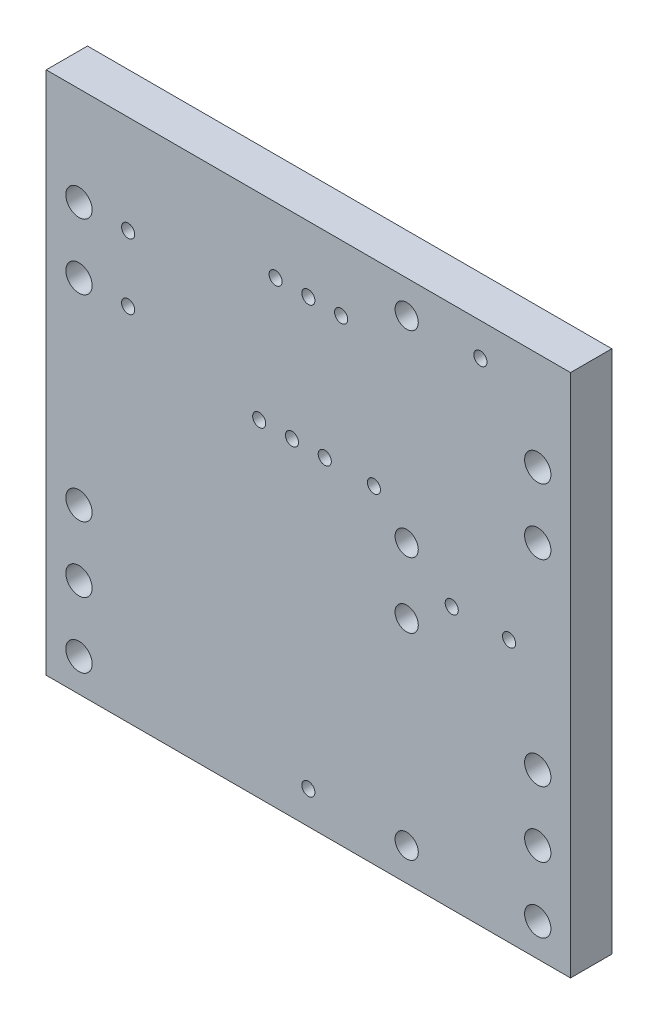
ISO-10303-21;
HEADER;
FILE_DESCRIPTION(('STEP AP214'),'2;1');
FILE_NAME('part.step','',(''),(''),'','','');
FILE_SCHEMA(('AUTOMOTIVE_DESIGN { 1 0 10303 214 1 1 1 1 }'));
ENDSEC;
DATA;
#1=APPLICATION_CONTEXT('core data for automotive mechanical design processes');
#2=APPLICATION_PROTOCOL_DEFINITION('international standard','automotive_design',2000,#1);
#3=PRODUCT_CONTEXT('',#1,'mechanical');
#4=PRODUCT('Part','Part','',(#3));
#5=PRODUCT_RELATED_PRODUCT_CATEGORY('part','',(#4));
#6=PRODUCT_DEFINITION_FORMATION('','',#4);
#7=PRODUCT_DEFINITION_CONTEXT('part definition',#1,'design');
#8=PRODUCT_DEFINITION('design','',#6,#7);
#9=PRODUCT_DEFINITION_SHAPE('','',#8);
#10=(LENGTH_UNIT() NAMED_UNIT(*) SI_UNIT(.MILLI.,.METRE.));
#11=(NAMED_UNIT(*) PLANE_ANGLE_UNIT() SI_UNIT($,.RADIAN.));
#12=(NAMED_UNIT(*) SI_UNIT($,.STERADIAN.) SOLID_ANGLE_UNIT());
#13=UNCERTAINTY_MEASURE_WITH_UNIT(LENGTH_MEASURE(1.E-05),#10,'distance_accuracy_value','');
#14=(GEOMETRIC_REPRESENTATION_CONTEXT(3) GLOBAL_UNCERTAINTY_ASSIGNED_CONTEXT((#13)) GLOBAL_UNIT_ASSIGNED_CONTEXT((#10,
#11,#12)) REPRESENTATION_CONTEXT('',''));
#15=CARTESIAN_POINT('',(0.,0.,0.));
#16=DIRECTION('',(0.,0.,1.));
#17=DIRECTION('',(1.,0.,0.));
#18=AXIS2_PLACEMENT_3D('',#15,#16,#17);
#19=CARTESIAN_POINT('',(0.,0.,1.6));
#20=DIRECTION('',(0.,0.,1.));
#21=DIRECTION('',(1.,0.,0.));
#22=AXIS2_PLACEMENT_3D('',#19,#20,#21);
#23=PLANE('',#22);
#24=CARTESIAN_POINT('',(13.97,11.43,1.6));
#25=DIRECTION('',(0.,0.,1.));
#26=DIRECTION('',(1.,0.,0.));
#27=AXIS2_PLACEMENT_3D('',#24,#25,#26);
#28=CIRCLE('',#27,0.450000000000001);
#29=CARTESIAN_POINT('',(14.42,11.43,1.6));
#30=VERTEX_POINT('',#29);
#31=EDGE_CURVE('E258',#30,#30,#28,.T.);
#32=ORIENTED_EDGE('',*,*,#31,.F.);
#33=EDGE_LOOP('',(#32));
#34=FACE_BOUND('',#33,.T.);
#35=CARTESIAN_POINT('',(13.97,8.89,1.6));
#36=DIRECTION('',(0.,0.,1.));
#37=DIRECTION('',(1.,0.,0.));
#38=AXIS2_PLACEMENT_3D('',#35,#36,#37);
#39=CIRCLE('',#38,0.450000000000001);
#40=CARTESIAN_POINT('',(14.42,8.89,1.6));
#41=VERTEX_POINT('',#40);
#42=EDGE_CURVE('E246',#41,#41,#39,.T.);
#43=ORIENTED_EDGE('',*,*,#42,.F.);
#44=EDGE_LOOP('',(#43));
#45=FACE_BOUND('',#44,.T.);
#46=CARTESIAN_POINT('',(19.05,3.81,1.6));
#47=DIRECTION('',(0.,0.,1.));
#48=DIRECTION('',(1.,0.,0.));
#49=AXIS2_PLACEMENT_3D('',#46,#47,#48);
#50=CIRCLE('',#49,0.51);
#51=CARTESIAN_POINT('',(19.56,3.81,1.6));
#52=VERTEX_POINT('',#51);
#53=EDGE_CURVE('E234',#52,#52,#50,.T.);
#54=ORIENTED_EDGE('',*,*,#53,.F.);
#55=EDGE_LOOP('',(#54));
#56=FACE_BOUND('',#55,.T.);
#57=CARTESIAN_POINT('',(1.27,13.97,1.6));
#58=DIRECTION('',(0.,0.,1.));
#59=DIRECTION('',(1.,0.,0.));
#60=AXIS2_PLACEMENT_3D('',#57,#58,#59);
#61=CIRCLE('',#60,0.51);
#62=CARTESIAN_POINT('',(1.78,13.97,1.6));
#63=VERTEX_POINT('',#62);
#64=EDGE_CURVE('E222',#63,#63,#61,.T.);
#65=ORIENTED_EDGE('',*,*,#64,.F.);
#66=EDGE_LOOP('',(#65));
#67=FACE_BOUND('',#66,.T.);
#68=CARTESIAN_POINT('',(19.05,13.97,1.6));
#69=DIRECTION('',(0.,0.,1.));
#70=DIRECTION('',(1.,0.,0.));
#71=AXIS2_PLACEMENT_3D('',#68,#69,#70);
#72=CIRCLE('',#71,0.51);
#73=CARTESIAN_POINT('',(19.56,13.97,1.6));
#74=VERTEX_POINT('',#73);
#75=EDGE_CURVE('E210',#74,#74,#72,.T.);
#76=ORIENTED_EDGE('',*,*,#75,.F.);
#77=EDGE_LOOP('',(#76));
#78=FACE_BOUND('',#77,.T.);
#79=CARTESIAN_POINT('',(1.27,6.35,1.6));
#80=DIRECTION('',(0.,0.,1.));
#81=DIRECTION('',(1.,0.,0.));
#82=AXIS2_PLACEMENT_3D('',#79,#80,#81);
#83=CIRCLE('',#82,0.51);
#84=CARTESIAN_POINT('',(1.78,6.35,1.6));
#85=VERTEX_POINT('',#84);
#86=EDGE_CURVE('E198',#85,#85,#83,.T.);
#87=ORIENTED_EDGE('',*,*,#86,.F.);
#88=EDGE_LOOP('',(#87));
#89=FACE_BOUND('',#88,.T.);
#90=CARTESIAN_POINT('',(1.27,1.27,1.6));
#91=DIRECTION('',(0.,0.,1.));
#92=DIRECTION('',(1.,0.,0.));
#93=AXIS2_PLACEMENT_3D('',#90,#91,#92);
#94=CIRCLE('',#93,0.51);
#95=CARTESIAN_POINT('',(1.78,1.27,1.6));
#96=VERTEX_POINT('',#95);
#97=EDGE_CURVE('E186',#96,#96,#94,.T.);
#98=ORIENTED_EDGE('',*,*,#97,.F.);
#99=EDGE_LOOP('',(#98));
#100=FACE_BOUND('',#99,.T.);
#101=CARTESIAN_POINT('',(10.16,1.27,1.6));
#102=DIRECTION('',(0.,0.,1.));
#103=DIRECTION('',(1.,0.,0.));
#104=AXIS2_PLACEMENT_3D('',#101,#102,#103);
#105=CIRCLE('',#104,0.254000000000001);
#106=CARTESIAN_POINT('',(10.414,1.27,1.6));
#107=VERTEX_POINT('',#106);
#108=EDGE_CURVE('E174',#107,#107,#105,.T.);
#109=ORIENTED_EDGE('',*,*,#108,.F.);
#110=EDGE_LOOP('',(#109));
#111=FACE_BOUND('',#110,.T.);
#112=CARTESIAN_POINT('',(17.9388,10.16,1.6));
#113=DIRECTION('',(0.,0.,1.));
#114=DIRECTION('',(1.,0.,0.));
#115=AXIS2_PLACEMENT_3D('',#112,#113,#114);
#116=CIRCLE('',#115,0.254000000000001);
#117=CARTESIAN_POINT('',(18.1928,10.16,1.6));
#118=VERTEX_POINT('',#117);
#119=EDGE_CURVE('E162',#118,#118,#116,.T.);
#120=ORIENTED_EDGE('',*,*,#119,.F.);
#121=EDGE_LOOP('',(#120));
#122=FACE_BOUND('',#121,.T.);
#123=CARTESIAN_POINT('',(16.8275,19.05,1.6));
#124=DIRECTION('',(0.,0.,1.));
#125=DIRECTION('',(1.,0.,0.));
#126=AXIS2_PLACEMENT_3D('',#123,#124,#125);
#127=CIRCLE('',#126,0.254000000000001);
#128=CARTESIAN_POINT('',(17.0815,19.05,1.6));
#129=VERTEX_POINT('',#128);
#130=EDGE_CURVE('E150',#129,#129,#127,.T.);
#131=ORIENTED_EDGE('',*,*,#130,.F.);
#132=EDGE_LOOP('',(#131));
#133=FACE_BOUND('',#132,.T.);
#134=CARTESIAN_POINT('',(8.89,17.78,1.6));
#135=DIRECTION('',(0.,0.,1.));
#136=DIRECTION('',(1.,0.,0.));
#137=AXIS2_PLACEMENT_3D('',#134,#135,#136);
#138=CIRCLE('',#137,0.254000000000001);
#139=CARTESIAN_POINT('',(9.144,17.78,1.6));
#140=VERTEX_POINT('',#139);
#141=EDGE_CURVE('E138',#140,#140,#138,.T.);
#142=ORIENTED_EDGE('',*,*,#141,.F.);
#143=EDGE_LOOP('',(#142));
#144=FACE_BOUND('',#143,.T.);
#145=CARTESIAN_POINT('',(10.795,12.7,1.6));
#146=DIRECTION('',(0.,0.,1.));
#147=DIRECTION('',(1.,0.,0.));
#148=AXIS2_PLACEMENT_3D('',#145,#146,#147);
#149=CIRCLE('',#148,0.254000000000001);
#150=CARTESIAN_POINT('',(11.049,12.7,1.6));
#151=VERTEX_POINT('',#150);
#152=EDGE_CURVE('E126',#151,#151,#149,.T.);
#153=ORIENTED_EDGE('',*,*,#152,.F.);
#154=EDGE_LOOP('',(#153));
#155=FACE_BOUND('',#154,.T.);
#156=CARTESIAN_POINT('',(11.43,17.78,1.6));
#157=DIRECTION('',(0.,0.,1.));
#158=DIRECTION('',(1.,0.,0.));
#159=AXIS2_PLACEMENT_3D('',#156,#157,#158);
#160=CIRCLE('',#159,0.254000000000001);
#161=CARTESIAN_POINT('',(11.684,17.78,1.6));
#162=VERTEX_POINT('',#161);
#163=EDGE_CURVE('E114',#162,#162,#160,.T.);
#164=ORIENTED_EDGE('',*,*,#163,.F.);
#165=EDGE_LOOP('',(#164));
#166=FACE_BOUND('',#165,.T.);
#167=DIRECTION('',(0.,-1.,0.));
#168=VECTOR('',#167,1.);
#169=CARTESIAN_POINT('',(0.,20.32,1.6));
#170=LINE('',#169,#168);
#171=CARTESIAN_POINT('',(0.,20.32,1.6));
#172=VERTEX_POINT('',#171);
#173=CARTESIAN_POINT('',(0.,0.,1.6));
#174=VERTEX_POINT('',#173);
#175=EDGE_CURVE('E84',#172,#174,#170,.T.);
#176=ORIENTED_EDGE('',*,*,#175,.T.);
#177=DIRECTION('',(1.,0.,0.));
#178=VECTOR('',#177,1.);
#179=CARTESIAN_POINT('',(0.,0.,1.6));
#180=LINE('',#179,#178);
#181=CARTESIAN_POINT('',(20.32,0.,1.6));
#182=VERTEX_POINT('',#181);
#183=EDGE_CURVE('E79',#174,#182,#180,.T.);
#184=ORIENTED_EDGE('',*,*,#183,.T.);
#185=DIRECTION('',(0.,1.,0.));
#186=VECTOR('',#185,1.);
#187=CARTESIAN_POINT('',(20.32,0.,1.6));
#188=LINE('',#187,#186);
#189=CARTESIAN_POINT('',(20.32,20.32,1.6));
#190=VERTEX_POINT('',#189);
#191=EDGE_CURVE('E82',#182,#190,#188,.T.);
#192=ORIENTED_EDGE('',*,*,#191,.T.);
#193=DIRECTION('',(-1.,0.,0.));
#194=VECTOR('',#193,1.);
#195=CARTESIAN_POINT('',(20.32,20.32,1.6));
#196=LINE('',#195,#194);
#197=EDGE_CURVE('E49',#190,#172,#196,.T.);
#198=ORIENTED_EDGE('',*,*,#197,.T.);
#199=EDGE_LOOP('',(#176,#184,#192,#198));
#200=FACE_BOUND('',#199,.T.);
#201=CARTESIAN_POINT('',(9.525,12.7,1.6));
#202=DIRECTION('',(0.,0.,1.));
#203=DIRECTION('',(1.,0.,0.));
#204=AXIS2_PLACEMENT_3D('',#201,#202,#203);
#205=CIRCLE('',#204,0.254000000000001);
#206=CARTESIAN_POINT('',(9.779,12.7,1.6));
#207=VERTEX_POINT('',#206);
#208=EDGE_CURVE('E99',#207,#207,#205,.T.);
#209=ORIENTED_EDGE('',*,*,#208,.F.);
#210=EDGE_LOOP('',(#209));
#211=FACE_BOUND('',#210,.T.);
#212=CARTESIAN_POINT('',(10.16,17.78,1.6));
#213=DIRECTION('',(0.,0.,1.));
#214=DIRECTION('',(1.,0.,0.));
#215=AXIS2_PLACEMENT_3D('',#212,#213,#214);
#216=CIRCLE('',#215,0.254000000000001);
#217=CARTESIAN_POINT('',(10.414,17.78,1.6));
#218=VERTEX_POINT('',#217);
#219=EDGE_CURVE('E120',#218,#218,#216,.T.);
#220=ORIENTED_EDGE('',*,*,#219,.F.);
#221=EDGE_LOOP('',(#220));
#222=FACE_BOUND('',#221,.T.);
#223=CARTESIAN_POINT('',(3.175,13.97,1.6));
#224=DIRECTION('',(0.,0.,1.));
#225=DIRECTION('',(1.,0.,0.));
#226=AXIS2_PLACEMENT_3D('',#223,#224,#225);
#227=CIRCLE('',#226,0.254);
#228=CARTESIAN_POINT('',(3.429,13.97,1.6));
#229=VERTEX_POINT('',#228);
#230=EDGE_CURVE('E132',#229,#229,#227,.T.);
#231=ORIENTED_EDGE('',*,*,#230,.F.);
#232=EDGE_LOOP('',(#231));
#233=FACE_BOUND('',#232,.T.);
#234=CARTESIAN_POINT('',(15.7163,10.16,1.6));
#235=DIRECTION('',(0.,0.,1.));
#236=DIRECTION('',(1.,0.,0.));
#237=AXIS2_PLACEMENT_3D('',#234,#235,#236);
#238=CIRCLE('',#237,0.254000000000001);
#239=CARTESIAN_POINT('',(15.9703,10.16,1.6));
#240=VERTEX_POINT('',#239);
#241=EDGE_CURVE('E144',#240,#240,#238,.T.);
#242=ORIENTED_EDGE('',*,*,#241,.F.);
#243=EDGE_LOOP('',(#242));
#244=FACE_BOUND('',#243,.T.);
#245=CARTESIAN_POINT('',(8.255,12.7,1.6));
#246=DIRECTION('',(0.,0.,1.));
#247=DIRECTION('',(1.,0.,0.));
#248=AXIS2_PLACEMENT_3D('',#245,#246,#247);
#249=CIRCLE('',#248,0.254000000000001);
#250=CARTESIAN_POINT('',(8.509,12.7,1.6));
#251=VERTEX_POINT('',#250);
#252=EDGE_CURVE('E156',#251,#251,#249,.T.);
#253=ORIENTED_EDGE('',*,*,#252,.F.);
#254=EDGE_LOOP('',(#253));
#255=FACE_BOUND('',#254,.T.);
#256=CARTESIAN_POINT('',(12.7,12.7,1.6));
#257=DIRECTION('',(0.,0.,1.));
#258=DIRECTION('',(1.,0.,0.));
#259=AXIS2_PLACEMENT_3D('',#256,#257,#258);
#260=CIRCLE('',#259,0.254000000000001);
#261=CARTESIAN_POINT('',(12.954,12.7,1.6));
#262=VERTEX_POINT('',#261);
#263=EDGE_CURVE('E168',#262,#262,#260,.T.);
#264=ORIENTED_EDGE('',*,*,#263,.F.);
#265=EDGE_LOOP('',(#264));
#266=FACE_BOUND('',#265,.T.);
#267=CARTESIAN_POINT('',(3.175,16.51,1.6));
#268=DIRECTION('',(0.,0.,1.));
#269=DIRECTION('',(1.,0.,0.));
#270=AXIS2_PLACEMENT_3D('',#267,#268,#269);
#271=CIRCLE('',#270,0.254);
#272=CARTESIAN_POINT('',(3.429,16.51,1.6));
#273=VERTEX_POINT('',#272);
#274=EDGE_CURVE('E180',#273,#273,#271,.T.);
#275=ORIENTED_EDGE('',*,*,#274,.F.);
#276=EDGE_LOOP('',(#275));
#277=FACE_BOUND('',#276,.T.);
#278=CARTESIAN_POINT('',(1.27,3.81,1.6));
#279=DIRECTION('',(0.,0.,1.));
#280=DIRECTION('',(1.,0.,0.));
#281=AXIS2_PLACEMENT_3D('',#278,#279,#280);
#282=CIRCLE('',#281,0.51);
#283=CARTESIAN_POINT('',(1.78,3.81,1.6));
#284=VERTEX_POINT('',#283);
#285=EDGE_CURVE('E192',#284,#284,#282,.T.);
#286=ORIENTED_EDGE('',*,*,#285,.F.);
#287=EDGE_LOOP('',(#286));
#288=FACE_BOUND('',#287,.T.);
#289=CARTESIAN_POINT('',(19.05,16.51,1.6));
#290=DIRECTION('',(0.,0.,1.));
#291=DIRECTION('',(1.,0.,0.));
#292=AXIS2_PLACEMENT_3D('',#289,#290,#291);
#293=CIRCLE('',#292,0.51);
#294=CARTESIAN_POINT('',(19.56,16.51,1.6));
#295=VERTEX_POINT('',#294);
#296=EDGE_CURVE('E204',#295,#295,#293,.T.);
#297=ORIENTED_EDGE('',*,*,#296,.F.);
#298=EDGE_LOOP('',(#297));
#299=FACE_BOUND('',#298,.T.);
#300=CARTESIAN_POINT('',(1.27,16.51,1.6));
#301=DIRECTION('',(0.,0.,1.));
#302=DIRECTION('',(1.,0.,0.));
#303=AXIS2_PLACEMENT_3D('',#300,#301,#302);
#304=CIRCLE('',#303,0.51);
#305=CARTESIAN_POINT('',(1.78,16.51,1.6));
#306=VERTEX_POINT('',#305);
#307=EDGE_CURVE('E216',#306,#306,#304,.T.);
#308=ORIENTED_EDGE('',*,*,#307,.F.);
#309=EDGE_LOOP('',(#308));
#310=FACE_BOUND('',#309,.T.);
#311=CARTESIAN_POINT('',(19.05,1.27,1.6));
#312=DIRECTION('',(0.,0.,1.));
#313=DIRECTION('',(1.,0.,0.));
#314=AXIS2_PLACEMENT_3D('',#311,#312,#313);
#315=CIRCLE('',#314,0.51);
#316=CARTESIAN_POINT('',(19.56,1.27,1.6));
#317=VERTEX_POINT('',#316);
#318=EDGE_CURVE('E228',#317,#317,#315,.T.);
#319=ORIENTED_EDGE('',*,*,#318,.F.);
#320=EDGE_LOOP('',(#319));
#321=FACE_BOUND('',#320,.T.);
#322=CARTESIAN_POINT('',(19.05,6.35,1.6));
#323=DIRECTION('',(0.,0.,1.));
#324=DIRECTION('',(1.,0.,0.));
#325=AXIS2_PLACEMENT_3D('',#322,#323,#324);
#326=CIRCLE('',#325,0.51);
#327=CARTESIAN_POINT('',(19.56,6.35,1.6));
#328=VERTEX_POINT('',#327);
#329=EDGE_CURVE('E240',#328,#328,#326,.T.);
#330=ORIENTED_EDGE('',*,*,#329,.F.);
#331=EDGE_LOOP('',(#330));
#332=FACE_BOUND('',#331,.T.);
#333=CARTESIAN_POINT('',(13.97,1.27,1.6));
#334=DIRECTION('',(0.,0.,1.));
#335=DIRECTION('',(1.,0.,0.));
#336=AXIS2_PLACEMENT_3D('',#333,#334,#335);
#337=CIRCLE('',#336,0.450000000000001);
#338=CARTESIAN_POINT('',(14.42,1.27,1.6));
#339=VERTEX_POINT('',#338);
#340=EDGE_CURVE('E252',#339,#339,#337,.T.);
#341=ORIENTED_EDGE('',*,*,#340,.F.);
#342=EDGE_LOOP('',(#341));
#343=FACE_BOUND('',#342,.T.);
#344=CARTESIAN_POINT('',(13.97,19.05,1.6));
#345=DIRECTION('',(0.,0.,1.));
#346=DIRECTION('',(1.,0.,0.));
#347=AXIS2_PLACEMENT_3D('',#344,#345,#346);
#348=CIRCLE('',#347,0.450000000000001);
#349=CARTESIAN_POINT('',(14.42,19.05,1.6));
#350=VERTEX_POINT('',#349);
#351=EDGE_CURVE('E264',#350,#350,#348,.T.);
#352=ORIENTED_EDGE('',*,*,#351,.F.);
#353=EDGE_LOOP('',(#352));
#354=FACE_BOUND('',#353,.T.);
#355=ADVANCED_FACE('F32',(#34,#45,#56,#67,#78,#89,#100,#111,#122,#133,#144,#155,#166,#200,#211,
#222,#233,#244,#255,#266,#277,#288,#299,#310,#321,#332,#343,#354),#23,.T.);
#356=CARTESIAN_POINT('',(0.,0.,0.));
#357=DIRECTION('',(0.,0.,1.));
#358=DIRECTION('',(1.,0.,0.));
#359=AXIS2_PLACEMENT_3D('',#356,#357,#358);
#360=PLANE('',#359);
#361=CARTESIAN_POINT('',(13.97,11.43,0.));
#362=DIRECTION('',(0.,0.,1.));
#363=DIRECTION('',(1.,0.,0.));
#364=AXIS2_PLACEMENT_3D('',#361,#362,#363);
#365=CIRCLE('',#364,0.450000000000001);
#366=CARTESIAN_POINT('',(14.42,11.43,0.));
#367=VERTEX_POINT('',#366);
#368=EDGE_CURVE('E261',#367,#367,#365,.T.);
#369=ORIENTED_EDGE('',*,*,#368,.T.);
#370=EDGE_LOOP('',(#369));
#371=FACE_BOUND('',#370,.T.);
#372=CARTESIAN_POINT('',(13.97,8.89,0.));
#373=DIRECTION('',(0.,0.,1.));
#374=DIRECTION('',(1.,0.,0.));
#375=AXIS2_PLACEMENT_3D('',#372,#373,#374);
#376=CIRCLE('',#375,0.450000000000001);
#377=CARTESIAN_POINT('',(14.42,8.89,0.));
#378=VERTEX_POINT('',#377);
#379=EDGE_CURVE('E249',#378,#378,#376,.T.);
#380=ORIENTED_EDGE('',*,*,#379,.T.);
#381=EDGE_LOOP('',(#380));
#382=FACE_BOUND('',#381,.T.);
#383=CARTESIAN_POINT('',(19.05,3.81,0.));
#384=DIRECTION('',(0.,0.,1.));
#385=DIRECTION('',(1.,0.,0.));
#386=AXIS2_PLACEMENT_3D('',#383,#384,#385);
#387=CIRCLE('',#386,0.51);
#388=CARTESIAN_POINT('',(19.56,3.81,0.));
#389=VERTEX_POINT('',#388);
#390=EDGE_CURVE('E237',#389,#389,#387,.T.);
#391=ORIENTED_EDGE('',*,*,#390,.T.);
#392=EDGE_LOOP('',(#391));
#393=FACE_BOUND('',#392,.T.);
#394=CARTESIAN_POINT('',(1.27,13.97,0.));
#395=DIRECTION('',(0.,0.,1.));
#396=DIRECTION('',(1.,0.,0.));
#397=AXIS2_PLACEMENT_3D('',#394,#395,#396);
#398=CIRCLE('',#397,0.51);
#399=CARTESIAN_POINT('',(1.78,13.97,0.));
#400=VERTEX_POINT('',#399);
#401=EDGE_CURVE('E225',#400,#400,#398,.T.);
#402=ORIENTED_EDGE('',*,*,#401,.T.);
#403=EDGE_LOOP('',(#402));
#404=FACE_BOUND('',#403,.T.);
#405=CARTESIAN_POINT('',(19.05,13.97,0.));
#406=DIRECTION('',(0.,0.,1.));
#407=DIRECTION('',(1.,0.,0.));
#408=AXIS2_PLACEMENT_3D('',#405,#406,#407);
#409=CIRCLE('',#408,0.51);
#410=CARTESIAN_POINT('',(19.56,13.97,0.));
#411=VERTEX_POINT('',#410);
#412=EDGE_CURVE('E213',#411,#411,#409,.T.);
#413=ORIENTED_EDGE('',*,*,#412,.T.);
#414=EDGE_LOOP('',(#413));
#415=FACE_BOUND('',#414,.T.);
#416=CARTESIAN_POINT('',(1.27,6.35,0.));
#417=DIRECTION('',(0.,0.,1.));
#418=DIRECTION('',(1.,0.,0.));
#419=AXIS2_PLACEMENT_3D('',#416,#417,#418);
#420=CIRCLE('',#419,0.51);
#421=CARTESIAN_POINT('',(1.78,6.35,0.));
#422=VERTEX_POINT('',#421);
#423=EDGE_CURVE('E201',#422,#422,#420,.T.);
#424=ORIENTED_EDGE('',*,*,#423,.T.);
#425=EDGE_LOOP('',(#424));
#426=FACE_BOUND('',#425,.T.);
#427=CARTESIAN_POINT('',(1.27,1.27,0.));
#428=DIRECTION('',(0.,0.,1.));
#429=DIRECTION('',(1.,0.,0.));
#430=AXIS2_PLACEMENT_3D('',#427,#428,#429);
#431=CIRCLE('',#430,0.51);
#432=CARTESIAN_POINT('',(1.78,1.27,0.));
#433=VERTEX_POINT('',#432);
#434=EDGE_CURVE('E189',#433,#433,#431,.T.);
#435=ORIENTED_EDGE('',*,*,#434,.T.);
#436=EDGE_LOOP('',(#435));
#437=FACE_BOUND('',#436,.T.);
#438=CARTESIAN_POINT('',(10.16,1.27,0.));
#439=DIRECTION('',(0.,0.,1.));
#440=DIRECTION('',(1.,0.,0.));
#441=AXIS2_PLACEMENT_3D('',#438,#439,#440);
#442=CIRCLE('',#441,0.254000000000001);
#443=CARTESIAN_POINT('',(10.414,1.27,0.));
#444=VERTEX_POINT('',#443);
#445=EDGE_CURVE('E177',#444,#444,#442,.T.);
#446=ORIENTED_EDGE('',*,*,#445,.T.);
#447=EDGE_LOOP('',(#446));
#448=FACE_BOUND('',#447,.T.);
#449=CARTESIAN_POINT('',(17.9388,10.16,0.));
#450=DIRECTION('',(0.,0.,1.));
#451=DIRECTION('',(1.,0.,0.));
#452=AXIS2_PLACEMENT_3D('',#449,#450,#451);
#453=CIRCLE('',#452,0.254000000000001);
#454=CARTESIAN_POINT('',(18.1928,10.16,0.));
#455=VERTEX_POINT('',#454);
#456=EDGE_CURVE('E165',#455,#455,#453,.T.);
#457=ORIENTED_EDGE('',*,*,#456,.T.);
#458=EDGE_LOOP('',(#457));
#459=FACE_BOUND('',#458,.T.);
#460=CARTESIAN_POINT('',(16.8275,19.05,0.));
#461=DIRECTION('',(0.,0.,1.));
#462=DIRECTION('',(1.,0.,0.));
#463=AXIS2_PLACEMENT_3D('',#460,#461,#462);
#464=CIRCLE('',#463,0.254000000000001);
#465=CARTESIAN_POINT('',(17.0815,19.05,0.));
#466=VERTEX_POINT('',#465);
#467=EDGE_CURVE('E153',#466,#466,#464,.T.);
#468=ORIENTED_EDGE('',*,*,#467,.T.);
#469=EDGE_LOOP('',(#468));
#470=FACE_BOUND('',#469,.T.);
#471=CARTESIAN_POINT('',(8.89,17.78,0.));
#472=DIRECTION('',(0.,0.,1.));
#473=DIRECTION('',(1.,0.,0.));
#474=AXIS2_PLACEMENT_3D('',#471,#472,#473);
#475=CIRCLE('',#474,0.254000000000001);
#476=CARTESIAN_POINT('',(9.144,17.78,0.));
#477=VERTEX_POINT('',#476);
#478=EDGE_CURVE('E141',#477,#477,#475,.T.);
#479=ORIENTED_EDGE('',*,*,#478,.T.);
#480=EDGE_LOOP('',(#479));
#481=FACE_BOUND('',#480,.T.);
#482=CARTESIAN_POINT('',(10.795,12.7,0.));
#483=DIRECTION('',(0.,0.,1.));
#484=DIRECTION('',(1.,0.,0.));
#485=AXIS2_PLACEMENT_3D('',#482,#483,#484);
#486=CIRCLE('',#485,0.254000000000001);
#487=CARTESIAN_POINT('',(11.049,12.7,0.));
#488=VERTEX_POINT('',#487);
#489=EDGE_CURVE('E129',#488,#488,#486,.T.);
#490=ORIENTED_EDGE('',*,*,#489,.T.);
#491=EDGE_LOOP('',(#490));
#492=FACE_BOUND('',#491,.T.);
#493=CARTESIAN_POINT('',(11.43,17.78,0.));
#494=DIRECTION('',(0.,0.,1.));
#495=DIRECTION('',(1.,0.,0.));
#496=AXIS2_PLACEMENT_3D('',#493,#494,#495);
#497=CIRCLE('',#496,0.254000000000001);
#498=CARTESIAN_POINT('',(11.684,17.78,0.));
#499=VERTEX_POINT('',#498);
#500=EDGE_CURVE('E117',#499,#499,#497,.T.);
#501=ORIENTED_EDGE('',*,*,#500,.T.);
#502=EDGE_LOOP('',(#501));
#503=FACE_BOUND('',#502,.T.);
#504=DIRECTION('',(0.,-1.,0.));
#505=VECTOR('',#504,1.);
#506=CARTESIAN_POINT('',(0.,20.32,0.));
#507=LINE('',#506,#505);
#508=CARTESIAN_POINT('',(0.,20.32,0.));
#509=VERTEX_POINT('',#508);
#510=CARTESIAN_POINT('',(0.,0.,0.));
#511=VERTEX_POINT('',#510);
#512=EDGE_CURVE('E96',#509,#511,#507,.T.);
#513=ORIENTED_EDGE('',*,*,#512,.F.);
#514=DIRECTION('',(-1.,0.,0.));
#515=VECTOR('',#514,1.);
#516=CARTESIAN_POINT('',(20.32,20.32,0.));
#517=LINE('',#516,#515);
#518=CARTESIAN_POINT('',(20.32,20.32,0.));
#519=VERTEX_POINT('',#518);
#520=EDGE_CURVE('E72',#519,#509,#517,.T.);
#521=ORIENTED_EDGE('',*,*,#520,.F.);
#522=DIRECTION('',(0.,1.,0.));
#523=VECTOR('',#522,1.);
#524=CARTESIAN_POINT('',(20.32,0.,0.));
#525=LINE('',#524,#523);
#526=CARTESIAN_POINT('',(20.32,0.,0.));
#527=VERTEX_POINT('',#526);
#528=EDGE_CURVE('E66',#527,#519,#525,.T.);
#529=ORIENTED_EDGE('',*,*,#528,.F.);
#530=DIRECTION('',(1.,0.,0.));
#531=VECTOR('',#530,1.);
#532=CARTESIAN_POINT('',(0.,0.,0.));
#533=LINE('',#532,#531);
#534=EDGE_CURVE('E88',#511,#527,#533,.T.);
#535=ORIENTED_EDGE('',*,*,#534,.F.);
#536=EDGE_LOOP('',(#513,#521,#529,#535));
#537=FACE_BOUND('',#536,.T.);
#538=CARTESIAN_POINT('',(9.525,12.7,0.));
#539=DIRECTION('',(0.,0.,1.));
#540=DIRECTION('',(1.,0.,0.));
#541=AXIS2_PLACEMENT_3D('',#538,#539,#540);
#542=CIRCLE('',#541,0.254000000000001);
#543=CARTESIAN_POINT('',(9.779,12.7,0.));
#544=VERTEX_POINT('',#543);
#545=EDGE_CURVE('E111',#544,#544,#542,.T.);
#546=ORIENTED_EDGE('',*,*,#545,.T.);
#547=EDGE_LOOP('',(#546));
#548=FACE_BOUND('',#547,.T.);
#549=CARTESIAN_POINT('',(10.16,17.78,0.));
#550=DIRECTION('',(0.,0.,1.));
#551=DIRECTION('',(1.,0.,0.));
#552=AXIS2_PLACEMENT_3D('',#549,#550,#551);
#553=CIRCLE('',#552,0.254000000000001);
#554=CARTESIAN_POINT('',(10.414,17.78,0.));
#555=VERTEX_POINT('',#554);
#556=EDGE_CURVE('E123',#555,#555,#553,.T.);
#557=ORIENTED_EDGE('',*,*,#556,.T.);
#558=EDGE_LOOP('',(#557));
#559=FACE_BOUND('',#558,.T.);
#560=CARTESIAN_POINT('',(3.175,13.97,0.));
#561=DIRECTION('',(0.,0.,1.));
#562=DIRECTION('',(1.,0.,0.));
#563=AXIS2_PLACEMENT_3D('',#560,#561,#562);
#564=CIRCLE('',#563,0.254);
#565=CARTESIAN_POINT('',(3.429,13.97,0.));
#566=VERTEX_POINT('',#565);
#567=EDGE_CURVE('E135',#566,#566,#564,.T.);
#568=ORIENTED_EDGE('',*,*,#567,.T.);
#569=EDGE_LOOP('',(#568));
#570=FACE_BOUND('',#569,.T.);
#571=CARTESIAN_POINT('',(15.7163,10.16,0.));
#572=DIRECTION('',(0.,0.,1.));
#573=DIRECTION('',(1.,0.,0.));
#574=AXIS2_PLACEMENT_3D('',#571,#572,#573);
#575=CIRCLE('',#574,0.254000000000001);
#576=CARTESIAN_POINT('',(15.9703,10.16,0.));
#577=VERTEX_POINT('',#576);
#578=EDGE_CURVE('E147',#577,#577,#575,.T.);
#579=ORIENTED_EDGE('',*,*,#578,.T.);
#580=EDGE_LOOP('',(#579));
#581=FACE_BOUND('',#580,.T.);
#582=CARTESIAN_POINT('',(8.255,12.7,0.));
#583=DIRECTION('',(0.,0.,1.));
#584=DIRECTION('',(1.,0.,0.));
#585=AXIS2_PLACEMENT_3D('',#582,#583,#584);
#586=CIRCLE('',#585,0.254000000000001);
#587=CARTESIAN_POINT('',(8.509,12.7,0.));
#588=VERTEX_POINT('',#587);
#589=EDGE_CURVE('E159',#588,#588,#586,.T.);
#590=ORIENTED_EDGE('',*,*,#589,.T.);
#591=EDGE_LOOP('',(#590));
#592=FACE_BOUND('',#591,.T.);
#593=CARTESIAN_POINT('',(12.7,12.7,0.));
#594=DIRECTION('',(0.,0.,1.));
#595=DIRECTION('',(1.,0.,0.));
#596=AXIS2_PLACEMENT_3D('',#593,#594,#595);
#597=CIRCLE('',#596,0.254000000000001);
#598=CARTESIAN_POINT('',(12.954,12.7,0.));
#599=VERTEX_POINT('',#598);
#600=EDGE_CURVE('E171',#599,#599,#597,.T.);
#601=ORIENTED_EDGE('',*,*,#600,.T.);
#602=EDGE_LOOP('',(#601));
#603=FACE_BOUND('',#602,.T.);
#604=CARTESIAN_POINT('',(3.175,16.51,0.));
#605=DIRECTION('',(0.,0.,1.));
#606=DIRECTION('',(1.,0.,0.));
#607=AXIS2_PLACEMENT_3D('',#604,#605,#606);
#608=CIRCLE('',#607,0.254);
#609=CARTESIAN_POINT('',(3.429,16.51,0.));
#610=VERTEX_POINT('',#609);
#611=EDGE_CURVE('E183',#610,#610,#608,.T.);
#612=ORIENTED_EDGE('',*,*,#611,.T.);
#613=EDGE_LOOP('',(#612));
#614=FACE_BOUND('',#613,.T.);
#615=CARTESIAN_POINT('',(1.27,3.81,0.));
#616=DIRECTION('',(0.,0.,1.));
#617=DIRECTION('',(1.,0.,0.));
#618=AXIS2_PLACEMENT_3D('',#615,#616,#617);
#619=CIRCLE('',#618,0.51);
#620=CARTESIAN_POINT('',(1.78,3.81,0.));
#621=VERTEX_POINT('',#620);
#622=EDGE_CURVE('E195',#621,#621,#619,.T.);
#623=ORIENTED_EDGE('',*,*,#622,.T.);
#624=EDGE_LOOP('',(#623));
#625=FACE_BOUND('',#624,.T.);
#626=CARTESIAN_POINT('',(19.05,16.51,0.));
#627=DIRECTION('',(0.,0.,1.));
#628=DIRECTION('',(1.,0.,0.));
#629=AXIS2_PLACEMENT_3D('',#626,#627,#628);
#630=CIRCLE('',#629,0.51);
#631=CARTESIAN_POINT('',(19.56,16.51,0.));
#632=VERTEX_POINT('',#631);
#633=EDGE_CURVE('E207',#632,#632,#630,.T.);
#634=ORIENTED_EDGE('',*,*,#633,.T.);
#635=EDGE_LOOP('',(#634));
#636=FACE_BOUND('',#635,.T.);
#637=CARTESIAN_POINT('',(1.27,16.51,0.));
#638=DIRECTION('',(0.,0.,1.));
#639=DIRECTION('',(1.,0.,0.));
#640=AXIS2_PLACEMENT_3D('',#637,#638,#639);
#641=CIRCLE('',#640,0.51);
#642=CARTESIAN_POINT('',(1.78,16.51,0.));
#643=VERTEX_POINT('',#642);
#644=EDGE_CURVE('E219',#643,#643,#641,.T.);
#645=ORIENTED_EDGE('',*,*,#644,.T.);
#646=EDGE_LOOP('',(#645));
#647=FACE_BOUND('',#646,.T.);
#648=CARTESIAN_POINT('',(19.05,1.27,0.));
#649=DIRECTION('',(0.,0.,1.));
#650=DIRECTION('',(1.,0.,0.));
#651=AXIS2_PLACEMENT_3D('',#648,#649,#650);
#652=CIRCLE('',#651,0.51);
#653=CARTESIAN_POINT('',(19.56,1.27,0.));
#654=VERTEX_POINT('',#653);
#655=EDGE_CURVE('E231',#654,#654,#652,.T.);
#656=ORIENTED_EDGE('',*,*,#655,.T.);
#657=EDGE_LOOP('',(#656));
#658=FACE_BOUND('',#657,.T.);
#659=CARTESIAN_POINT('',(19.05,6.35,0.));
#660=DIRECTION('',(0.,0.,1.));
#661=DIRECTION('',(1.,0.,0.));
#662=AXIS2_PLACEMENT_3D('',#659,#660,#661);
#663=CIRCLE('',#662,0.51);
#664=CARTESIAN_POINT('',(19.56,6.35,0.));
#665=VERTEX_POINT('',#664);
#666=EDGE_CURVE('E243',#665,#665,#663,.T.);
#667=ORIENTED_EDGE('',*,*,#666,.T.);
#668=EDGE_LOOP('',(#667));
#669=FACE_BOUND('',#668,.T.);
#670=CARTESIAN_POINT('',(13.97,1.27,0.));
#671=DIRECTION('',(0.,0.,1.));
#672=DIRECTION('',(1.,0.,0.));
#673=AXIS2_PLACEMENT_3D('',#670,#671,#672);
#674=CIRCLE('',#673,0.450000000000001);
#675=CARTESIAN_POINT('',(14.42,1.27,0.));
#676=VERTEX_POINT('',#675);
#677=EDGE_CURVE('E255',#676,#676,#674,.T.);
#678=ORIENTED_EDGE('',*,*,#677,.T.);
#679=EDGE_LOOP('',(#678));
#680=FACE_BOUND('',#679,.T.);
#681=CARTESIAN_POINT('',(13.97,19.05,0.));
#682=DIRECTION('',(0.,0.,1.));
#683=DIRECTION('',(1.,0.,0.));
#684=AXIS2_PLACEMENT_3D('',#681,#682,#683);
#685=CIRCLE('',#684,0.450000000000001);
#686=CARTESIAN_POINT('',(14.42,19.05,0.));
#687=VERTEX_POINT('',#686);
#688=EDGE_CURVE('E267',#687,#687,#685,.T.);
#689=ORIENTED_EDGE('',*,*,#688,.T.);
#690=EDGE_LOOP('',(#689));
#691=FACE_BOUND('',#690,.T.);
#692=ADVANCED_FACE('F107',(#371,#382,#393,#404,#415,#426,#437,#448,#459,#470,#481,#492,#503,
#537,#548,#559,#570,#581,#592,#603,#614,#625,#636,#647,#658,#669,#680,#691),#360,.F.);
#693=CARTESIAN_POINT('',(0.,20.32,1.6));
#694=DIRECTION('',(1.,0.,0.));
#695=DIRECTION('',(0.,0.,-1.));
#696=AXIS2_PLACEMENT_3D('',#693,#694,#695);
#697=PLANE('',#696);
#698=ORIENTED_EDGE('',*,*,#512,.T.);
#699=DIRECTION('',(0.,0.,-1.));
#700=VECTOR('',#699,1.);
#701=CARTESIAN_POINT('',(0.,0.,1.6));
#702=LINE('',#701,#700);
#703=EDGE_CURVE('E11',#174,#511,#702,.T.);
#704=ORIENTED_EDGE('',*,*,#703,.F.);
#705=ORIENTED_EDGE('',*,*,#175,.F.);
#706=DIRECTION('',(0.,0.,-1.));
#707=VECTOR('',#706,1.);
#708=CARTESIAN_POINT('',(0.,20.32,1.6));
#709=LINE('',#708,#707);
#710=EDGE_CURVE('E92',#172,#509,#709,.T.);
#711=ORIENTED_EDGE('',*,*,#710,.T.);
#712=EDGE_LOOP('',(#698,#704,#705,#711));
#713=FACE_BOUND('',#712,.T.);
#714=ADVANCED_FACE('F34',(#713),#697,.F.);
#715=CARTESIAN_POINT('',(0.,0.,1.6));
#716=DIRECTION('',(0.,1.,0.));
#717=DIRECTION('',(0.,0.,1.));
#718=AXIS2_PLACEMENT_3D('',#715,#716,#717);
#719=PLANE('',#718);
#720=ORIENTED_EDGE('',*,*,#534,.T.);
#721=DIRECTION('',(0.,0.,-1.));
#722=VECTOR('',#721,1.);
#723=CARTESIAN_POINT('',(20.32,0.,1.6));
#724=LINE('',#723,#722);
#725=EDGE_CURVE('E41',#182,#527,#724,.T.);
#726=ORIENTED_EDGE('',*,*,#725,.F.);
#727=ORIENTED_EDGE('',*,*,#183,.F.);
#728=ORIENTED_EDGE('',*,*,#703,.T.);
#729=EDGE_LOOP('',(#720,#726,#727,#728));
#730=FACE_BOUND('',#729,.T.);
#731=ADVANCED_FACE('F87',(#730),#719,.F.);
#732=CARTESIAN_POINT('',(20.32,0.,1.6));
#733=DIRECTION('',(-1.,0.,0.));
#734=DIRECTION('',(0.,0.,1.));
#735=AXIS2_PLACEMENT_3D('',#732,#733,#734);
#736=PLANE('',#735);
#737=ORIENTED_EDGE('',*,*,#528,.T.);
#738=DIRECTION('',(0.,0.,-1.));
#739=VECTOR('',#738,1.);
#740=CARTESIAN_POINT('',(20.32,20.32,1.6));
#741=LINE('',#740,#739);
#742=EDGE_CURVE('E89',#190,#519,#741,.T.);
#743=ORIENTED_EDGE('',*,*,#742,.F.);
#744=ORIENTED_EDGE('',*,*,#191,.F.);
#745=ORIENTED_EDGE('',*,*,#725,.T.);
#746=EDGE_LOOP('',(#737,#743,#744,#745));
#747=FACE_BOUND('',#746,.T.);
#748=ADVANCED_FACE('F90',(#747),#736,.F.);
#749=CARTESIAN_POINT('',(20.32,20.32,1.6));
#750=DIRECTION('',(0.,-1.,0.));
#751=DIRECTION('',(0.,0.,-1.));
#752=AXIS2_PLACEMENT_3D('',#749,#750,#751);
#753=PLANE('',#752);
#754=ORIENTED_EDGE('',*,*,#520,.T.);
#755=ORIENTED_EDGE('',*,*,#710,.F.);
#756=ORIENTED_EDGE('',*,*,#197,.F.);
#757=ORIENTED_EDGE('',*,*,#742,.T.);
#758=EDGE_LOOP('',(#754,#755,#756,#757));
#759=FACE_BOUND('',#758,.T.);
#760=ADVANCED_FACE('F104',(#759),#753,.F.);
#761=CARTESIAN_POINT('',(9.525,12.7,1.6));
#762=DIRECTION('',(0.,0.,-1.));
#763=DIRECTION('',(-1.,0.,0.));
#764=AXIS2_PLACEMENT_3D('',#761,#762,#763);
#765=CYLINDRICAL_SURFACE('',#764,0.254000000000001);
#766=ORIENTED_EDGE('',*,*,#208,.T.);
#767=EDGE_LOOP('',(#766));
#768=FACE_BOUND('',#767,.T.);
#769=ORIENTED_EDGE('',*,*,#545,.F.);
#770=EDGE_LOOP('',(#769));
#771=FACE_BOUND('',#770,.T.);
#772=ADVANCED_FACE('F287',(#768,#771),#765,.F.);
#773=CARTESIAN_POINT('',(11.43,17.78,1.6));
#774=DIRECTION('',(0.,0.,-1.));
#775=DIRECTION('',(-1.,0.,0.));
#776=AXIS2_PLACEMENT_3D('',#773,#774,#775);
#777=CYLINDRICAL_SURFACE('',#776,0.254000000000001);
#778=ORIENTED_EDGE('',*,*,#163,.T.);
#779=EDGE_LOOP('',(#778));
#780=FACE_BOUND('',#779,.T.);
#781=ORIENTED_EDGE('',*,*,#500,.F.);
#782=EDGE_LOOP('',(#781));
#783=FACE_BOUND('',#782,.T.);
#784=ADVANCED_FACE('F492',(#780,#783),#777,.F.);
#785=CARTESIAN_POINT('',(10.16,17.78,1.6));
#786=DIRECTION('',(0.,0.,-1.));
#787=DIRECTION('',(-1.,0.,0.));
#788=AXIS2_PLACEMENT_3D('',#785,#786,#787);
#789=CYLINDRICAL_SURFACE('',#788,0.254000000000001);
#790=ORIENTED_EDGE('',*,*,#219,.T.);
#791=EDGE_LOOP('',(#790));
#792=FACE_BOUND('',#791,.T.);
#793=ORIENTED_EDGE('',*,*,#556,.F.);
#794=EDGE_LOOP('',(#793));
#795=FACE_BOUND('',#794,.T.);
#796=ADVANCED_FACE('F489',(#792,#795),#789,.F.);
#797=CARTESIAN_POINT('',(10.795,12.7,1.6));
#798=DIRECTION('',(0.,0.,-1.));
#799=DIRECTION('',(-1.,0.,0.));
#800=AXIS2_PLACEMENT_3D('',#797,#798,#799);
#801=CYLINDRICAL_SURFACE('',#800,0.254000000000001);
#802=ORIENTED_EDGE('',*,*,#152,.T.);
#803=EDGE_LOOP('',(#802));
#804=FACE_BOUND('',#803,.T.);
#805=ORIENTED_EDGE('',*,*,#489,.F.);
#806=EDGE_LOOP('',(#805));
#807=FACE_BOUND('',#806,.T.);
#808=ADVANCED_FACE('F485',(#804,#807),#801,.F.);
#809=CARTESIAN_POINT('',(3.175,13.97,1.6));
#810=DIRECTION('',(0.,0.,-1.));
#811=DIRECTION('',(-1.,0.,0.));
#812=AXIS2_PLACEMENT_3D('',#809,#810,#811);
#813=CYLINDRICAL_SURFACE('',#812,0.254);
#814=ORIENTED_EDGE('',*,*,#230,.T.);
#815=EDGE_LOOP('',(#814));
#816=FACE_BOUND('',#815,.T.);
#817=ORIENTED_EDGE('',*,*,#567,.F.);
#818=EDGE_LOOP('',(#817));
#819=FACE_BOUND('',#818,.T.);
#820=ADVANCED_FACE('F481',(#816,#819),#813,.F.);
#821=CARTESIAN_POINT('',(8.89,17.78,1.6));
#822=DIRECTION('',(0.,0.,-1.));
#823=DIRECTION('',(-1.,0.,0.));
#824=AXIS2_PLACEMENT_3D('',#821,#822,#823);
#825=CYLINDRICAL_SURFACE('',#824,0.254000000000001);
#826=ORIENTED_EDGE('',*,*,#141,.T.);
#827=EDGE_LOOP('',(#826));
#828=FACE_BOUND('',#827,.T.);
#829=ORIENTED_EDGE('',*,*,#478,.F.);
#830=EDGE_LOOP('',(#829));
#831=FACE_BOUND('',#830,.T.);
#832=ADVANCED_FACE('F477',(#828,#831),#825,.F.);
#833=CARTESIAN_POINT('',(15.7163,10.16,1.6));
#834=DIRECTION('',(0.,0.,-1.));
#835=DIRECTION('',(-1.,0.,0.));
#836=AXIS2_PLACEMENT_3D('',#833,#834,#835);
#837=CYLINDRICAL_SURFACE('',#836,0.254000000000001);
#838=ORIENTED_EDGE('',*,*,#241,.T.);
#839=EDGE_LOOP('',(#838));
#840=FACE_BOUND('',#839,.T.);
#841=ORIENTED_EDGE('',*,*,#578,.F.);
#842=EDGE_LOOP('',(#841));
#843=FACE_BOUND('',#842,.T.);
#844=ADVANCED_FACE('F473',(#840,#843),#837,.F.);
#845=CARTESIAN_POINT('',(16.8275,19.05,1.6));
#846=DIRECTION('',(0.,0.,-1.));
#847=DIRECTION('',(-1.,0.,0.));
#848=AXIS2_PLACEMENT_3D('',#845,#846,#847);
#849=CYLINDRICAL_SURFACE('',#848,0.254000000000001);
#850=ORIENTED_EDGE('',*,*,#130,.T.);
#851=EDGE_LOOP('',(#850));
#852=FACE_BOUND('',#851,.T.);
#853=ORIENTED_EDGE('',*,*,#467,.F.);
#854=EDGE_LOOP('',(#853));
#855=FACE_BOUND('',#854,.T.);
#856=ADVANCED_FACE('F469',(#852,#855),#849,.F.);
#857=CARTESIAN_POINT('',(8.255,12.7,1.6));
#858=DIRECTION('',(0.,0.,-1.));
#859=DIRECTION('',(-1.,0.,0.));
#860=AXIS2_PLACEMENT_3D('',#857,#858,#859);
#861=CYLINDRICAL_SURFACE('',#860,0.254000000000001);
#862=ORIENTED_EDGE('',*,*,#252,.T.);
#863=EDGE_LOOP('',(#862));
#864=FACE_BOUND('',#863,.T.);
#865=ORIENTED_EDGE('',*,*,#589,.F.);
#866=EDGE_LOOP('',(#865));
#867=FACE_BOUND('',#866,.T.);
#868=ADVANCED_FACE('F465',(#864,#867),#861,.F.);
#869=CARTESIAN_POINT('',(17.9388,10.16,1.6));
#870=DIRECTION('',(0.,0.,-1.));
#871=DIRECTION('',(-1.,0.,0.));
#872=AXIS2_PLACEMENT_3D('',#869,#870,#871);
#873=CYLINDRICAL_SURFACE('',#872,0.254000000000001);
#874=ORIENTED_EDGE('',*,*,#119,.T.);
#875=EDGE_LOOP('',(#874));
#876=FACE_BOUND('',#875,.T.);
#877=ORIENTED_EDGE('',*,*,#456,.F.);
#878=EDGE_LOOP('',(#877));
#879=FACE_BOUND('',#878,.T.);
#880=ADVANCED_FACE('F461',(#876,#879),#873,.F.);
#881=CARTESIAN_POINT('',(12.7,12.7,1.6));
#882=DIRECTION('',(0.,0.,-1.));
#883=DIRECTION('',(-1.,0.,0.));
#884=AXIS2_PLACEMENT_3D('',#881,#882,#883);
#885=CYLINDRICAL_SURFACE('',#884,0.254000000000001);
#886=ORIENTED_EDGE('',*,*,#263,.T.);
#887=EDGE_LOOP('',(#886));
#888=FACE_BOUND('',#887,.T.);
#889=ORIENTED_EDGE('',*,*,#600,.F.);
#890=EDGE_LOOP('',(#889));
#891=FACE_BOUND('',#890,.T.);
#892=ADVANCED_FACE('F457',(#888,#891),#885,.F.);
#893=CARTESIAN_POINT('',(10.16,1.27,1.6));
#894=DIRECTION('',(0.,0.,-1.));
#895=DIRECTION('',(-1.,0.,0.));
#896=AXIS2_PLACEMENT_3D('',#893,#894,#895);
#897=CYLINDRICAL_SURFACE('',#896,0.254000000000001);
#898=ORIENTED_EDGE('',*,*,#108,.T.);
#899=EDGE_LOOP('',(#898));
#900=FACE_BOUND('',#899,.T.);
#901=ORIENTED_EDGE('',*,*,#445,.F.);
#902=EDGE_LOOP('',(#901));
#903=FACE_BOUND('',#902,.T.);
#904=ADVANCED_FACE('F453',(#900,#903),#897,.F.);
#905=CARTESIAN_POINT('',(3.175,16.51,1.6));
#906=DIRECTION('',(0.,0.,-1.));
#907=DIRECTION('',(-1.,0.,0.));
#908=AXIS2_PLACEMENT_3D('',#905,#906,#907);
#909=CYLINDRICAL_SURFACE('',#908,0.254);
#910=ORIENTED_EDGE('',*,*,#274,.T.);
#911=EDGE_LOOP('',(#910));
#912=FACE_BOUND('',#911,.T.);
#913=ORIENTED_EDGE('',*,*,#611,.F.);
#914=EDGE_LOOP('',(#913));
#915=FACE_BOUND('',#914,.T.);
#916=ADVANCED_FACE('F318',(#912,#915),#909,.F.);
#917=CARTESIAN_POINT('',(1.27,1.27,1.6));
#918=DIRECTION('',(0.,0.,-1.));
#919=DIRECTION('',(-1.,0.,0.));
#920=AXIS2_PLACEMENT_3D('',#917,#918,#919);
#921=CYLINDRICAL_SURFACE('',#920,0.51);
#922=ORIENTED_EDGE('',*,*,#97,.T.);
#923=EDGE_LOOP('',(#922));
#924=FACE_BOUND('',#923,.T.);
#925=ORIENTED_EDGE('',*,*,#434,.F.);
#926=EDGE_LOOP('',(#925));
#927=FACE_BOUND('',#926,.T.);
#928=ADVANCED_FACE('F312',(#924,#927),#921,.F.);
#929=CARTESIAN_POINT('',(1.27,3.81,1.6));
#930=DIRECTION('',(0.,0.,-1.));
#931=DIRECTION('',(-1.,0.,0.));
#932=AXIS2_PLACEMENT_3D('',#929,#930,#931);
#933=CYLINDRICAL_SURFACE('',#932,0.51);
#934=ORIENTED_EDGE('',*,*,#285,.T.);
#935=EDGE_LOOP('',(#934));
#936=FACE_BOUND('',#935,.T.);
#937=ORIENTED_EDGE('',*,*,#622,.F.);
#938=EDGE_LOOP('',(#937));
#939=FACE_BOUND('',#938,.T.);
#940=ADVANCED_FACE('F317',(#936,#939),#933,.F.);
#941=CARTESIAN_POINT('',(1.27,6.35,1.6));
#942=DIRECTION('',(0.,0.,-1.));
#943=DIRECTION('',(-1.,0.,0.));
#944=AXIS2_PLACEMENT_3D('',#941,#942,#943);
#945=CYLINDRICAL_SURFACE('',#944,0.51);
#946=ORIENTED_EDGE('',*,*,#86,.T.);
#947=EDGE_LOOP('',(#946));
#948=FACE_BOUND('',#947,.T.);
#949=ORIENTED_EDGE('',*,*,#423,.F.);
#950=EDGE_LOOP('',(#949));
#951=FACE_BOUND('',#950,.T.);
#952=ADVANCED_FACE('F329',(#948,#951),#945,.F.);
#953=CARTESIAN_POINT('',(19.05,16.51,1.6));
#954=DIRECTION('',(0.,0.,-1.));
#955=DIRECTION('',(-1.,0.,0.));
#956=AXIS2_PLACEMENT_3D('',#953,#954,#955);
#957=CYLINDRICAL_SURFACE('',#956,0.51);
#958=ORIENTED_EDGE('',*,*,#296,.T.);
#959=EDGE_LOOP('',(#958));
#960=FACE_BOUND('',#959,.T.);
#961=ORIENTED_EDGE('',*,*,#633,.F.);
#962=EDGE_LOOP('',(#961));
#963=FACE_BOUND('',#962,.T.);
#964=ADVANCED_FACE('F339',(#960,#963),#957,.F.);
#965=CARTESIAN_POINT('',(19.05,13.97,1.6));
#966=DIRECTION('',(0.,0.,-1.));
#967=DIRECTION('',(-1.,0.,0.));
#968=AXIS2_PLACEMENT_3D('',#965,#966,#967);
#969=CYLINDRICAL_SURFACE('',#968,0.51);
#970=ORIENTED_EDGE('',*,*,#75,.T.);
#971=EDGE_LOOP('',(#970));
#972=FACE_BOUND('',#971,.T.);
#973=ORIENTED_EDGE('',*,*,#412,.F.);
#974=EDGE_LOOP('',(#973));
#975=FACE_BOUND('',#974,.T.);
#976=ADVANCED_FACE('F349',(#972,#975),#969,.F.);
#977=CARTESIAN_POINT('',(1.27,16.51,1.6));
#978=DIRECTION('',(0.,0.,-1.));
#979=DIRECTION('',(-1.,0.,0.));
#980=AXIS2_PLACEMENT_3D('',#977,#978,#979);
#981=CYLINDRICAL_SURFACE('',#980,0.51);
#982=ORIENTED_EDGE('',*,*,#307,.T.);
#983=EDGE_LOOP('',(#982));
#984=FACE_BOUND('',#983,.T.);
#985=ORIENTED_EDGE('',*,*,#644,.F.);
#986=EDGE_LOOP('',(#985));
#987=FACE_BOUND('',#986,.T.);
#988=ADVANCED_FACE('F359',(#984,#987),#981,.F.);
#989=CARTESIAN_POINT('',(1.27,13.97,1.6));
#990=DIRECTION('',(0.,0.,-1.));
#991=DIRECTION('',(-1.,0.,0.));
#992=AXIS2_PLACEMENT_3D('',#989,#990,#991);
#993=CYLINDRICAL_SURFACE('',#992,0.51);
#994=ORIENTED_EDGE('',*,*,#64,.T.);
#995=EDGE_LOOP('',(#994));
#996=FACE_BOUND('',#995,.T.);
#997=ORIENTED_EDGE('',*,*,#401,.F.);
#998=EDGE_LOOP('',(#997));
#999=FACE_BOUND('',#998,.T.);
#1000=ADVANCED_FACE('F369',(#996,#999),#993,.F.);
#1001=CARTESIAN_POINT('',(19.05,1.27,1.6));
#1002=DIRECTION('',(0.,0.,-1.));
#1003=DIRECTION('',(-1.,0.,0.));
#1004=AXIS2_PLACEMENT_3D('',#1001,#1002,#1003);
#1005=CYLINDRICAL_SURFACE('',#1004,0.51);
#1006=ORIENTED_EDGE('',*,*,#318,.T.);
#1007=EDGE_LOOP('',(#1006));
#1008=FACE_BOUND('',#1007,.T.);
#1009=ORIENTED_EDGE('',*,*,#655,.F.);
#1010=EDGE_LOOP('',(#1009));
#1011=FACE_BOUND('',#1010,.T.);
#1012=ADVANCED_FACE('F379',(#1008,#1011),#1005,.F.);
#1013=CARTESIAN_POINT('',(19.05,3.81,1.6));
#1014=DIRECTION('',(0.,0.,-1.));
#1015=DIRECTION('',(-1.,0.,0.));
#1016=AXIS2_PLACEMENT_3D('',#1013,#1014,#1015);
#1017=CYLINDRICAL_SURFACE('',#1016,0.51);
#1018=ORIENTED_EDGE('',*,*,#53,.T.);
#1019=EDGE_LOOP('',(#1018));
#1020=FACE_BOUND('',#1019,.T.);
#1021=ORIENTED_EDGE('',*,*,#390,.F.);
#1022=EDGE_LOOP('',(#1021));
#1023=FACE_BOUND('',#1022,.T.);
#1024=ADVANCED_FACE('F389',(#1020,#1023),#1017,.F.);
#1025=CARTESIAN_POINT('',(19.05,6.35,1.6));
#1026=DIRECTION('',(0.,0.,-1.));
#1027=DIRECTION('',(-1.,0.,0.));
#1028=AXIS2_PLACEMENT_3D('',#1025,#1026,#1027);
#1029=CYLINDRICAL_SURFACE('',#1028,0.51);
#1030=ORIENTED_EDGE('',*,*,#329,.T.);
#1031=EDGE_LOOP('',(#1030));
#1032=FACE_BOUND('',#1031,.T.);
#1033=ORIENTED_EDGE('',*,*,#666,.F.);
#1034=EDGE_LOOP('',(#1033));
#1035=FACE_BOUND('',#1034,.T.);
#1036=ADVANCED_FACE('F399',(#1032,#1035),#1029,.F.);
#1037=CARTESIAN_POINT('',(13.97,8.89,1.6));
#1038=DIRECTION('',(0.,0.,-1.));
#1039=DIRECTION('',(-1.,0.,0.));
#1040=AXIS2_PLACEMENT_3D('',#1037,#1038,#1039);
#1041=CYLINDRICAL_SURFACE('',#1040,0.450000000000001);
#1042=ORIENTED_EDGE('',*,*,#42,.T.);
#1043=EDGE_LOOP('',(#1042));
#1044=FACE_BOUND('',#1043,.T.);
#1045=ORIENTED_EDGE('',*,*,#379,.F.);
#1046=EDGE_LOOP('',(#1045));
#1047=FACE_BOUND('',#1046,.T.);
#1048=ADVANCED_FACE('F409',(#1044,#1047),#1041,.F.);
#1049=CARTESIAN_POINT('',(13.97,1.27,1.6));
#1050=DIRECTION('',(0.,0.,-1.));
#1051=DIRECTION('',(-1.,0.,0.));
#1052=AXIS2_PLACEMENT_3D('',#1049,#1050,#1051);
#1053=CYLINDRICAL_SURFACE('',#1052,0.450000000000001);
#1054=ORIENTED_EDGE('',*,*,#340,.T.);
#1055=EDGE_LOOP('',(#1054));
#1056=FACE_BOUND('',#1055,.T.);
#1057=ORIENTED_EDGE('',*,*,#677,.F.);
#1058=EDGE_LOOP('',(#1057));
#1059=FACE_BOUND('',#1058,.T.);
#1060=ADVANCED_FACE('F419',(#1056,#1059),#1053,.F.);
#1061=CARTESIAN_POINT('',(13.97,11.43,1.6));
#1062=DIRECTION('',(0.,0.,-1.));
#1063=DIRECTION('',(-1.,0.,0.));
#1064=AXIS2_PLACEMENT_3D('',#1061,#1062,#1063);
#1065=CYLINDRICAL_SURFACE('',#1064,0.450000000000001);
#1066=ORIENTED_EDGE('',*,*,#31,.T.);
#1067=EDGE_LOOP('',(#1066));
#1068=FACE_BOUND('',#1067,.T.);
#1069=ORIENTED_EDGE('',*,*,#368,.F.);
#1070=EDGE_LOOP('',(#1069));
#1071=FACE_BOUND('',#1070,.T.);
#1072=ADVANCED_FACE('F429',(#1068,#1071),#1065,.F.);
#1073=CARTESIAN_POINT('',(13.97,19.05,1.6));
#1074=DIRECTION('',(0.,0.,-1.));
#1075=DIRECTION('',(-1.,0.,0.));
#1076=AXIS2_PLACEMENT_3D('',#1073,#1074,#1075);
#1077=CYLINDRICAL_SURFACE('',#1076,0.450000000000001);
#1078=ORIENTED_EDGE('',*,*,#351,.T.);
#1079=EDGE_LOOP('',(#1078));
#1080=FACE_BOUND('',#1079,.T.);
#1081=ORIENTED_EDGE('',*,*,#688,.F.);
#1082=EDGE_LOOP('',(#1081));
#1083=FACE_BOUND('',#1082,.T.);
#1084=ADVANCED_FACE('F273',(#1080,#1083),#1077,.F.);
#1085=CLOSED_SHELL('',(#355,#692,#714,#731,#748,#760,#772,#784,#796,#808,#820,#832,#844,#856,
#868,#880,#892,#904,#916,#928,#940,#952,#964,#976,#988,#1000,#1012,#1024,#1036,#1048,#1060,
#1072,#1084));
#1086=MANIFOLD_SOLID_BREP('B2',#1085);
#1087=ADVANCED_BREP_SHAPE_REPRESENTATION('',(#18,#1086),#14);
#1088=SHAPE_DEFINITION_REPRESENTATION(#9,#1087);
ENDSEC;
END-ISO-10303-21;
